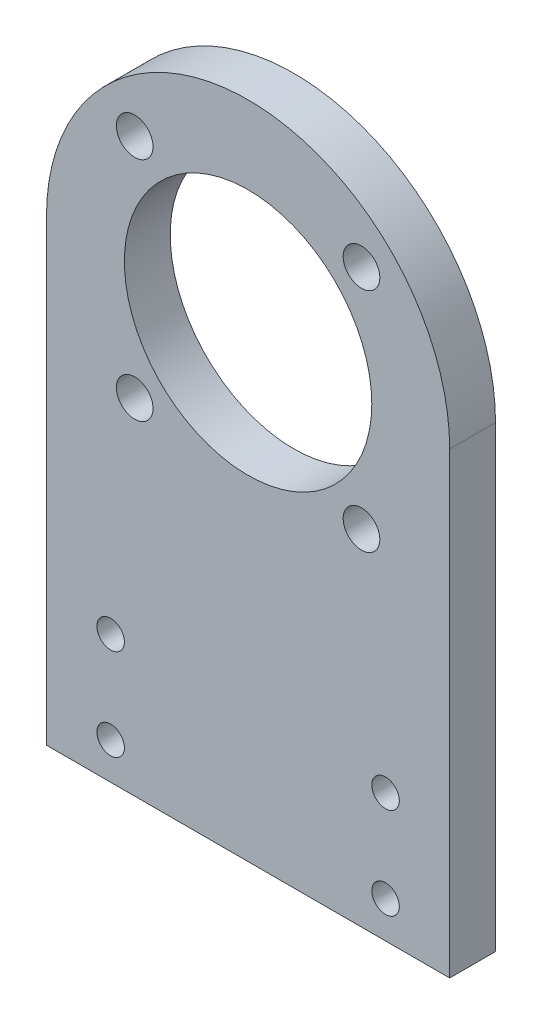
ISO-10303-21;
HEADER;
FILE_DESCRIPTION(('STEP AP214'),'2;1');
FILE_NAME('part.step','',(''),(''),'','','');
FILE_SCHEMA(('AUTOMOTIVE_DESIGN { 1 0 10303 214 1 1 1 1 }'));
ENDSEC;
DATA;
#1=APPLICATION_CONTEXT('core data for automotive mechanical design processes');
#2=APPLICATION_PROTOCOL_DEFINITION('international standard','automotive_design',2000,#1);
#3=PRODUCT_CONTEXT('',#1,'mechanical');
#4=PRODUCT('Part','Part','',(#3));
#5=PRODUCT_RELATED_PRODUCT_CATEGORY('part','',(#4));
#6=PRODUCT_DEFINITION_FORMATION('','',#4);
#7=PRODUCT_DEFINITION_CONTEXT('part definition',#1,'design');
#8=PRODUCT_DEFINITION('design','',#6,#7);
#9=PRODUCT_DEFINITION_SHAPE('','',#8);
#10=(LENGTH_UNIT() NAMED_UNIT(*) SI_UNIT(.MILLI.,.METRE.));
#11=(NAMED_UNIT(*) PLANE_ANGLE_UNIT() SI_UNIT($,.RADIAN.));
#12=(NAMED_UNIT(*) SI_UNIT($,.STERADIAN.) SOLID_ANGLE_UNIT());
#13=UNCERTAINTY_MEASURE_WITH_UNIT(LENGTH_MEASURE(1.E-05),#10,'distance_accuracy_value','');
#14=(GEOMETRIC_REPRESENTATION_CONTEXT(3) GLOBAL_UNCERTAINTY_ASSIGNED_CONTEXT((#13)) GLOBAL_UNIT_ASSIGNED_CONTEXT((#10,
#11,#12)) REPRESENTATION_CONTEXT('',''));
#15=CARTESIAN_POINT('',(0.,0.,0.));
#16=DIRECTION('',(0.,0.,1.));
#17=DIRECTION('',(1.,0.,0.));
#18=AXIS2_PLACEMENT_3D('',#15,#16,#17);
#19=CARTESIAN_POINT('',(1.17961196366423E-13,50.,5.));
#20=DIRECTION('',(0.,0.,1.));
#21=DIRECTION('',(1.,0.,0.));
#22=AXIS2_PLACEMENT_3D('',#19,#20,#21);
#23=PLANE('',#22);
#24=CARTESIAN_POINT('',(-12.3743686707645,37.6256313292355,5.));
#25=DIRECTION('',(0.,0.,-1.));
#26=DIRECTION('',(-1.,0.,0.));
#27=AXIS2_PLACEMENT_3D('',#24,#25,#26);
#28=CIRCLE('',#27,2.);
#29=CARTESIAN_POINT('',(-14.3743686707645,37.6256313292355,5.));
#30=VERTEX_POINT('',#29);
#31=EDGE_CURVE('E149',#30,#30,#28,.T.);
#32=ORIENTED_EDGE('',*,*,#31,.T.);
#33=EDGE_LOOP('',(#32));
#34=FACE_BOUND('',#33,.T.);
#35=CARTESIAN_POINT('',(12.3743686707647,37.6256313292354,5.));
#36=DIRECTION('',(0.,0.,-1.));
#37=DIRECTION('',(-1.,0.,0.));
#38=AXIS2_PLACEMENT_3D('',#35,#36,#37);
#39=CIRCLE('',#38,2.);
#40=CARTESIAN_POINT('',(10.3743686707647,37.6256313292354,5.));
#41=VERTEX_POINT('',#40);
#42=EDGE_CURVE('E161',#41,#41,#39,.T.);
#43=ORIENTED_EDGE('',*,*,#42,.T.);
#44=EDGE_LOOP('',(#43));
#45=FACE_BOUND('',#44,.T.);
#46=CARTESIAN_POINT('',(12.3743686707647,62.3743686707646,5.));
#47=DIRECTION('',(0.,0.,-1.));
#48=DIRECTION('',(-1.,0.,0.));
#49=AXIS2_PLACEMENT_3D('',#46,#47,#48);
#50=CIRCLE('',#49,2.);
#51=CARTESIAN_POINT('',(10.3743686707647,62.3743686707646,5.));
#52=VERTEX_POINT('',#51);
#53=EDGE_CURVE('E155',#52,#52,#50,.T.);
#54=ORIENTED_EDGE('',*,*,#53,.T.);
#55=EDGE_LOOP('',(#54));
#56=FACE_BOUND('',#55,.T.);
#57=CARTESIAN_POINT('',(-12.3743686707644,62.3743686707646,5.));
#58=DIRECTION('',(0.,0.,-1.));
#59=DIRECTION('',(-1.,0.,0.));
#60=AXIS2_PLACEMENT_3D('',#57,#58,#59);
#61=CIRCLE('',#60,2.);
#62=CARTESIAN_POINT('',(-14.3743686707645,62.3743686707646,5.));
#63=VERTEX_POINT('',#62);
#64=EDGE_CURVE('E143',#63,#63,#61,.T.);
#65=ORIENTED_EDGE('',*,*,#64,.T.);
#66=EDGE_LOOP('',(#65));
#67=FACE_BOUND('',#66,.T.);
#68=CARTESIAN_POINT('',(15.,14.,5.));
#69=DIRECTION('',(0.,0.,1.));
#70=DIRECTION('',(-1.,0.,0.));
#71=AXIS2_PLACEMENT_3D('',#68,#69,#70);
#72=CIRCLE('',#71,1.5);
#73=CARTESIAN_POINT('',(13.5,14.,5.));
#74=VERTEX_POINT('',#73);
#75=EDGE_CURVE('E131',#74,#74,#72,.T.);
#76=ORIENTED_EDGE('',*,*,#75,.F.);
#77=EDGE_LOOP('',(#76));
#78=FACE_BOUND('',#77,.T.);
#79=CARTESIAN_POINT('',(-15.,4.,5.));
#80=DIRECTION('',(0.,0.,1.));
#81=DIRECTION('',(1.,0.,0.));
#82=AXIS2_PLACEMENT_3D('',#79,#80,#81);
#83=CIRCLE('',#82,1.5);
#84=CARTESIAN_POINT('',(-13.5,4.,5.));
#85=VERTEX_POINT('',#84);
#86=EDGE_CURVE('E119',#85,#85,#83,.T.);
#87=ORIENTED_EDGE('',*,*,#86,.F.);
#88=EDGE_LOOP('',(#87));
#89=FACE_BOUND('',#88,.T.);
#90=DIRECTION('',(0.,-1.,0.));
#91=VECTOR('',#90,1.);
#92=CARTESIAN_POINT('',(-22.,0.,5.));
#93=LINE('',#92,#91);
#94=CARTESIAN_POINT('',(-21.9999999999999,50.,5.));
#95=VERTEX_POINT('',#94);
#96=CARTESIAN_POINT('',(-22.,0.,5.));
#97=VERTEX_POINT('',#96);
#98=EDGE_CURVE('E89',#95,#97,#93,.T.);
#99=ORIENTED_EDGE('',*,*,#98,.T.);
#100=DIRECTION('',(1.,0.,0.));
#101=VECTOR('',#100,1.);
#102=CARTESIAN_POINT('',(-22.,0.,5.));
#103=LINE('',#102,#101);
#104=CARTESIAN_POINT('',(22.,0.,5.));
#105=VERTEX_POINT('',#104);
#106=EDGE_CURVE('E84',#97,#105,#103,.T.);
#107=ORIENTED_EDGE('',*,*,#106,.T.);
#108=DIRECTION('',(0.,1.,0.));
#109=VECTOR('',#108,1.);
#110=CARTESIAN_POINT('',(22.,0.,5.));
#111=LINE('',#110,#109);
#112=CARTESIAN_POINT('',(22.,50.,5.));
#113=VERTEX_POINT('',#112);
#114=EDGE_CURVE('E87',#105,#113,#111,.T.);
#115=ORIENTED_EDGE('',*,*,#114,.T.);
#116=CARTESIAN_POINT('',(1.17961196366423E-13,50.,5.));
#117=DIRECTION('',(0.,0.,1.));
#118=DIRECTION('',(1.,0.,0.));
#119=AXIS2_PLACEMENT_3D('',#116,#117,#118);
#120=CIRCLE('',#119,22.);
#121=EDGE_CURVE('E54',#113,#95,#120,.T.);
#122=ORIENTED_EDGE('',*,*,#121,.T.);
#123=EDGE_LOOP('',(#99,#107,#115,#122));
#124=FACE_BOUND('',#123,.T.);
#125=CARTESIAN_POINT('',(-15.,14.,5.));
#126=DIRECTION('',(0.,0.,1.));
#127=DIRECTION('',(1.,0.,0.));
#128=AXIS2_PLACEMENT_3D('',#125,#126,#127);
#129=CIRCLE('',#128,1.5);
#130=CARTESIAN_POINT('',(-13.5,14.,5.));
#131=VERTEX_POINT('',#130);
#132=EDGE_CURVE('E104',#131,#131,#129,.T.);
#133=ORIENTED_EDGE('',*,*,#132,.F.);
#134=EDGE_LOOP('',(#133));
#135=FACE_BOUND('',#134,.T.);
#136=CARTESIAN_POINT('',(15.,4.,5.));
#137=DIRECTION('',(0.,0.,1.));
#138=DIRECTION('',(-1.,0.,0.));
#139=AXIS2_PLACEMENT_3D('',#136,#137,#138);
#140=CIRCLE('',#139,1.5);
#141=CARTESIAN_POINT('',(13.5,4.,5.));
#142=VERTEX_POINT('',#141);
#143=EDGE_CURVE('E125',#142,#142,#140,.T.);
#144=ORIENTED_EDGE('',*,*,#143,.F.);
#145=EDGE_LOOP('',(#144));
#146=FACE_BOUND('',#145,.T.);
#147=CARTESIAN_POINT('',(1.17961196366423E-13,50.,5.));
#148=DIRECTION('',(0.,0.,1.));
#149=DIRECTION('',(1.,0.,0.));
#150=AXIS2_PLACEMENT_3D('',#147,#148,#149);
#151=CIRCLE('',#150,13.5);
#152=CARTESIAN_POINT('',(13.5000000000001,50.,5.));
#153=VERTEX_POINT('',#152);
#154=EDGE_CURVE('E137',#153,#153,#151,.T.);
#155=ORIENTED_EDGE('',*,*,#154,.F.);
#156=EDGE_LOOP('',(#155));
#157=FACE_BOUND('',#156,.T.);
#158=ADVANCED_FACE('F37',(#34,#45,#56,#67,#78,#89,#124,#135,#146,#157),#23,.T.);
#159=CARTESIAN_POINT('',(1.17961196366423E-13,50.,0.));
#160=DIRECTION('',(0.,0.,1.));
#161=DIRECTION('',(1.,0.,0.));
#162=AXIS2_PLACEMENT_3D('',#159,#160,#161);
#163=PLANE('',#162);
#164=CARTESIAN_POINT('',(-12.3743686707645,37.6256313292355,0.));
#165=DIRECTION('',(0.,0.,-1.));
#166=DIRECTION('',(-1.,0.,0.));
#167=AXIS2_PLACEMENT_3D('',#164,#165,#166);
#168=CIRCLE('',#167,2.);
#169=CARTESIAN_POINT('',(-14.3743686707645,37.6256313292355,0.));
#170=VERTEX_POINT('',#169);
#171=EDGE_CURVE('E164',#170,#170,#168,.T.);
#172=ORIENTED_EDGE('',*,*,#171,.F.);
#173=EDGE_LOOP('',(#172));
#174=FACE_BOUND('',#173,.T.);
#175=CARTESIAN_POINT('',(12.3743686707647,37.6256313292354,0.));
#176=DIRECTION('',(0.,0.,-1.));
#177=DIRECTION('',(-1.,0.,0.));
#178=AXIS2_PLACEMENT_3D('',#175,#176,#177);
#179=CIRCLE('',#178,2.);
#180=CARTESIAN_POINT('',(10.3743686707647,37.6256313292354,0.));
#181=VERTEX_POINT('',#180);
#182=EDGE_CURVE('E158',#181,#181,#179,.T.);
#183=ORIENTED_EDGE('',*,*,#182,.F.);
#184=EDGE_LOOP('',(#183));
#185=FACE_BOUND('',#184,.T.);
#186=CARTESIAN_POINT('',(12.3743686707647,62.3743686707646,0.));
#187=DIRECTION('',(0.,0.,-1.));
#188=DIRECTION('',(-1.,0.,0.));
#189=AXIS2_PLACEMENT_3D('',#186,#187,#188);
#190=CIRCLE('',#189,2.);
#191=CARTESIAN_POINT('',(10.3743686707647,62.3743686707646,0.));
#192=VERTEX_POINT('',#191);
#193=EDGE_CURVE('E152',#192,#192,#190,.T.);
#194=ORIENTED_EDGE('',*,*,#193,.F.);
#195=EDGE_LOOP('',(#194));
#196=FACE_BOUND('',#195,.T.);
#197=CARTESIAN_POINT('',(-12.3743686707644,62.3743686707646,0.));
#198=DIRECTION('',(0.,0.,-1.));
#199=DIRECTION('',(-1.,0.,0.));
#200=AXIS2_PLACEMENT_3D('',#197,#198,#199);
#201=CIRCLE('',#200,2.);
#202=CARTESIAN_POINT('',(-14.3743686707645,62.3743686707646,0.));
#203=VERTEX_POINT('',#202);
#204=EDGE_CURVE('E146',#203,#203,#201,.T.);
#205=ORIENTED_EDGE('',*,*,#204,.F.);
#206=EDGE_LOOP('',(#205));
#207=FACE_BOUND('',#206,.T.);
#208=DIRECTION('',(0.,-1.,0.));
#209=VECTOR('',#208,1.);
#210=CARTESIAN_POINT('',(-22.,0.,0.));
#211=LINE('',#210,#209);
#212=CARTESIAN_POINT('',(-21.9999999999999,50.,0.));
#213=VERTEX_POINT('',#212);
#214=CARTESIAN_POINT('',(-22.,0.,0.));
#215=VERTEX_POINT('',#214);
#216=EDGE_CURVE('E101',#213,#215,#211,.T.);
#217=ORIENTED_EDGE('',*,*,#216,.F.);
#218=CARTESIAN_POINT('',(1.17961196366423E-13,50.,0.));
#219=DIRECTION('',(0.,0.,1.));
#220=DIRECTION('',(1.,0.,0.));
#221=AXIS2_PLACEMENT_3D('',#218,#219,#220);
#222=CIRCLE('',#221,22.);
#223=CARTESIAN_POINT('',(22.,50.,0.));
#224=VERTEX_POINT('',#223);
#225=EDGE_CURVE('E77',#224,#213,#222,.T.);
#226=ORIENTED_EDGE('',*,*,#225,.F.);
#227=DIRECTION('',(0.,1.,0.));
#228=VECTOR('',#227,1.);
#229=CARTESIAN_POINT('',(22.,0.,0.));
#230=LINE('',#229,#228);
#231=CARTESIAN_POINT('',(22.,0.,0.));
#232=VERTEX_POINT('',#231);
#233=EDGE_CURVE('E71',#232,#224,#230,.T.);
#234=ORIENTED_EDGE('',*,*,#233,.F.);
#235=DIRECTION('',(1.,0.,0.));
#236=VECTOR('',#235,1.);
#237=CARTESIAN_POINT('',(-22.,0.,0.));
#238=LINE('',#237,#236);
#239=EDGE_CURVE('E93',#215,#232,#238,.T.);
#240=ORIENTED_EDGE('',*,*,#239,.F.);
#241=EDGE_LOOP('',(#217,#226,#234,#240));
#242=FACE_BOUND('',#241,.T.);
#243=CARTESIAN_POINT('',(-15.,14.,0.));
#244=DIRECTION('',(0.,0.,1.));
#245=DIRECTION('',(1.,0.,0.));
#246=AXIS2_PLACEMENT_3D('',#243,#244,#245);
#247=CIRCLE('',#246,1.5);
#248=CARTESIAN_POINT('',(-13.5,14.,0.));
#249=VERTEX_POINT('',#248);
#250=EDGE_CURVE('E116',#249,#249,#247,.T.);
#251=ORIENTED_EDGE('',*,*,#250,.T.);
#252=EDGE_LOOP('',(#251));
#253=FACE_BOUND('',#252,.T.);
#254=CARTESIAN_POINT('',(-15.,4.,0.));
#255=DIRECTION('',(0.,0.,1.));
#256=DIRECTION('',(1.,0.,0.));
#257=AXIS2_PLACEMENT_3D('',#254,#255,#256);
#258=CIRCLE('',#257,1.5);
#259=CARTESIAN_POINT('',(-13.5,4.,0.));
#260=VERTEX_POINT('',#259);
#261=EDGE_CURVE('E122',#260,#260,#258,.T.);
#262=ORIENTED_EDGE('',*,*,#261,.T.);
#263=EDGE_LOOP('',(#262));
#264=FACE_BOUND('',#263,.T.);
#265=CARTESIAN_POINT('',(15.,4.,0.));
#266=DIRECTION('',(0.,0.,1.));
#267=DIRECTION('',(-1.,0.,0.));
#268=AXIS2_PLACEMENT_3D('',#265,#266,#267);
#269=CIRCLE('',#268,1.5);
#270=CARTESIAN_POINT('',(13.5,4.,0.));
#271=VERTEX_POINT('',#270);
#272=EDGE_CURVE('E128',#271,#271,#269,.T.);
#273=ORIENTED_EDGE('',*,*,#272,.T.);
#274=EDGE_LOOP('',(#273));
#275=FACE_BOUND('',#274,.T.);
#276=CARTESIAN_POINT('',(15.,14.,0.));
#277=DIRECTION('',(0.,0.,1.));
#278=DIRECTION('',(-1.,0.,0.));
#279=AXIS2_PLACEMENT_3D('',#276,#277,#278);
#280=CIRCLE('',#279,1.5);
#281=CARTESIAN_POINT('',(13.5,14.,0.));
#282=VERTEX_POINT('',#281);
#283=EDGE_CURVE('E134',#282,#282,#280,.T.);
#284=ORIENTED_EDGE('',*,*,#283,.T.);
#285=EDGE_LOOP('',(#284));
#286=FACE_BOUND('',#285,.T.);
#287=CARTESIAN_POINT('',(1.17961196366423E-13,50.,0.));
#288=DIRECTION('',(0.,0.,1.));
#289=DIRECTION('',(1.,0.,0.));
#290=AXIS2_PLACEMENT_3D('',#287,#288,#289);
#291=CIRCLE('',#290,13.5);
#292=CARTESIAN_POINT('',(13.5000000000001,50.,0.));
#293=VERTEX_POINT('',#292);
#294=EDGE_CURVE('E140',#293,#293,#291,.T.);
#295=ORIENTED_EDGE('',*,*,#294,.T.);
#296=EDGE_LOOP('',(#295));
#297=FACE_BOUND('',#296,.T.);
#298=ADVANCED_FACE('F112',(#174,#185,#196,#207,#242,#253,#264,#275,#286,#297),#163,.F.);
#299=CARTESIAN_POINT('',(-22.,0.,5.));
#300=DIRECTION('',(1.,0.,0.));
#301=DIRECTION('',(0.,0.,-1.));
#302=AXIS2_PLACEMENT_3D('',#299,#300,#301);
#303=PLANE('',#302);
#304=ORIENTED_EDGE('',*,*,#216,.T.);
#305=DIRECTION('',(0.,0.,-1.));
#306=VECTOR('',#305,1.);
#307=CARTESIAN_POINT('',(-22.,0.,5.));
#308=LINE('',#307,#306);
#309=EDGE_CURVE('E11',#97,#215,#308,.T.);
#310=ORIENTED_EDGE('',*,*,#309,.F.);
#311=ORIENTED_EDGE('',*,*,#98,.F.);
#312=DIRECTION('',(0.,0.,-1.));
#313=VECTOR('',#312,1.);
#314=CARTESIAN_POINT('',(-21.9999999999999,50.,5.));
#315=LINE('',#314,#313);
#316=EDGE_CURVE('E97',#95,#213,#315,.T.);
#317=ORIENTED_EDGE('',*,*,#316,.T.);
#318=EDGE_LOOP('',(#304,#310,#311,#317));
#319=FACE_BOUND('',#318,.T.);
#320=ADVANCED_FACE('F39',(#319),#303,.F.);
#321=CARTESIAN_POINT('',(-22.,0.,5.));
#322=DIRECTION('',(0.,1.,0.));
#323=DIRECTION('',(-1.,0.,0.));
#324=AXIS2_PLACEMENT_3D('',#321,#322,#323);
#325=PLANE('',#324);
#326=ORIENTED_EDGE('',*,*,#239,.T.);
#327=DIRECTION('',(0.,0.,-1.));
#328=VECTOR('',#327,1.);
#329=CARTESIAN_POINT('',(22.,0.,5.));
#330=LINE('',#329,#328);
#331=EDGE_CURVE('E46',#105,#232,#330,.T.);
#332=ORIENTED_EDGE('',*,*,#331,.F.);
#333=ORIENTED_EDGE('',*,*,#106,.F.);
#334=ORIENTED_EDGE('',*,*,#309,.T.);
#335=EDGE_LOOP('',(#326,#332,#333,#334));
#336=FACE_BOUND('',#335,.T.);
#337=ADVANCED_FACE('F92',(#336),#325,.F.);
#338=CARTESIAN_POINT('',(22.,0.,5.));
#339=DIRECTION('',(-1.,0.,0.));
#340=DIRECTION('',(0.,-1.,0.));
#341=AXIS2_PLACEMENT_3D('',#338,#339,#340);
#342=PLANE('',#341);
#343=ORIENTED_EDGE('',*,*,#233,.T.);
#344=DIRECTION('',(0.,0.,-1.));
#345=VECTOR('',#344,1.);
#346=CARTESIAN_POINT('',(22.,50.,5.));
#347=LINE('',#346,#345);
#348=EDGE_CURVE('E94',#113,#224,#347,.T.);
#349=ORIENTED_EDGE('',*,*,#348,.F.);
#350=ORIENTED_EDGE('',*,*,#114,.F.);
#351=ORIENTED_EDGE('',*,*,#331,.T.);
#352=EDGE_LOOP('',(#343,#349,#350,#351));
#353=FACE_BOUND('',#352,.T.);
#354=ADVANCED_FACE('F95',(#353),#342,.F.);
#355=CARTESIAN_POINT('',(1.17961196366423E-13,50.,5.));
#356=DIRECTION('',(0.,0.,-1.));
#357=DIRECTION('',(-1.,0.,0.));
#358=AXIS2_PLACEMENT_3D('',#355,#356,#357);
#359=CYLINDRICAL_SURFACE('',#358,22.);
#360=ORIENTED_EDGE('',*,*,#225,.T.);
#361=ORIENTED_EDGE('',*,*,#316,.F.);
#362=ORIENTED_EDGE('',*,*,#121,.F.);
#363=ORIENTED_EDGE('',*,*,#348,.T.);
#364=EDGE_LOOP('',(#360,#361,#362,#363));
#365=FACE_BOUND('',#364,.T.);
#366=ADVANCED_FACE('F109',(#365),#359,.T.);
#367=CARTESIAN_POINT('',(-15.,14.,5.));
#368=DIRECTION('',(0.,0.,-1.));
#369=DIRECTION('',(-1.,0.,0.));
#370=AXIS2_PLACEMENT_3D('',#367,#368,#369);
#371=CYLINDRICAL_SURFACE('',#370,1.5);
#372=ORIENTED_EDGE('',*,*,#132,.T.);
#373=EDGE_LOOP('',(#372));
#374=FACE_BOUND('',#373,.T.);
#375=ORIENTED_EDGE('',*,*,#250,.F.);
#376=EDGE_LOOP('',(#375));
#377=FACE_BOUND('',#376,.T.);
#378=ADVANCED_FACE('F209',(#374,#377),#371,.F.);
#379=CARTESIAN_POINT('',(-15.,4.,5.));
#380=DIRECTION('',(0.,0.,-1.));
#381=DIRECTION('',(-1.,0.,0.));
#382=AXIS2_PLACEMENT_3D('',#379,#380,#381);
#383=CYLINDRICAL_SURFACE('',#382,1.5);
#384=ORIENTED_EDGE('',*,*,#86,.T.);
#385=EDGE_LOOP('',(#384));
#386=FACE_BOUND('',#385,.T.);
#387=ORIENTED_EDGE('',*,*,#261,.F.);
#388=EDGE_LOOP('',(#387));
#389=FACE_BOUND('',#388,.T.);
#390=ADVANCED_FACE('F268',(#386,#389),#383,.F.);
#391=CARTESIAN_POINT('',(15.,4.,5.));
#392=DIRECTION('',(0.,0.,-1.));
#393=DIRECTION('',(-1.,0.,0.));
#394=AXIS2_PLACEMENT_3D('',#391,#392,#393);
#395=CYLINDRICAL_SURFACE('',#394,1.5);
#396=ORIENTED_EDGE('',*,*,#143,.T.);
#397=EDGE_LOOP('',(#396));
#398=FACE_BOUND('',#397,.T.);
#399=ORIENTED_EDGE('',*,*,#272,.F.);
#400=EDGE_LOOP('',(#399));
#401=FACE_BOUND('',#400,.T.);
#402=ADVANCED_FACE('F271',(#398,#401),#395,.F.);
#403=CARTESIAN_POINT('',(15.,14.,5.));
#404=DIRECTION('',(0.,0.,-1.));
#405=DIRECTION('',(-1.,0.,0.));
#406=AXIS2_PLACEMENT_3D('',#403,#404,#405);
#407=CYLINDRICAL_SURFACE('',#406,1.5);
#408=ORIENTED_EDGE('',*,*,#75,.T.);
#409=EDGE_LOOP('',(#408));
#410=FACE_BOUND('',#409,.T.);
#411=ORIENTED_EDGE('',*,*,#283,.F.);
#412=EDGE_LOOP('',(#411));
#413=FACE_BOUND('',#412,.T.);
#414=ADVANCED_FACE('F200',(#410,#413),#407,.F.);
#415=CARTESIAN_POINT('',(1.17961196366423E-13,50.,5.));
#416=DIRECTION('',(0.,0.,-1.));
#417=DIRECTION('',(-1.,0.,0.));
#418=AXIS2_PLACEMENT_3D('',#415,#416,#417);
#419=CYLINDRICAL_SURFACE('',#418,13.5);
#420=ORIENTED_EDGE('',*,*,#154,.T.);
#421=EDGE_LOOP('',(#420));
#422=FACE_BOUND('',#421,.T.);
#423=ORIENTED_EDGE('',*,*,#294,.F.);
#424=EDGE_LOOP('',(#423));
#425=FACE_BOUND('',#424,.T.);
#426=ADVANCED_FACE('F191',(#422,#425),#419,.F.);
#427=CARTESIAN_POINT('',(-12.3743686707644,62.3743686707646,5.));
#428=DIRECTION('',(0.,0.,-1.));
#429=DIRECTION('',(-1.,0.,0.));
#430=AXIS2_PLACEMENT_3D('',#427,#428,#429);
#431=CYLINDRICAL_SURFACE('',#430,2.);
#432=ORIENTED_EDGE('',*,*,#64,.F.);
#433=EDGE_LOOP('',(#432));
#434=FACE_BOUND('',#433,.T.);
#435=ORIENTED_EDGE('',*,*,#204,.T.);
#436=EDGE_LOOP('',(#435));
#437=FACE_BOUND('',#436,.T.);
#438=ADVANCED_FACE('F188',(#434,#437),#431,.F.);
#439=CARTESIAN_POINT('',(12.3743686707647,62.3743686707646,5.));
#440=DIRECTION('',(0.,0.,-1.));
#441=DIRECTION('',(-1.,0.,0.));
#442=AXIS2_PLACEMENT_3D('',#439,#440,#441);
#443=CYLINDRICAL_SURFACE('',#442,2.);
#444=ORIENTED_EDGE('',*,*,#53,.F.);
#445=EDGE_LOOP('',(#444));
#446=FACE_BOUND('',#445,.T.);
#447=ORIENTED_EDGE('',*,*,#193,.T.);
#448=EDGE_LOOP('',(#447));
#449=FACE_BOUND('',#448,.T.);
#450=ADVANCED_FACE('F190',(#446,#449),#443,.F.);
#451=CARTESIAN_POINT('',(12.3743686707647,37.6256313292354,5.));
#452=DIRECTION('',(0.,0.,-1.));
#453=DIRECTION('',(-1.,0.,0.));
#454=AXIS2_PLACEMENT_3D('',#451,#452,#453);
#455=CYLINDRICAL_SURFACE('',#454,2.);
#456=ORIENTED_EDGE('',*,*,#42,.F.);
#457=EDGE_LOOP('',(#456));
#458=FACE_BOUND('',#457,.T.);
#459=ORIENTED_EDGE('',*,*,#182,.T.);
#460=EDGE_LOOP('',(#459));
#461=FACE_BOUND('',#460,.T.);
#462=ADVANCED_FACE('F175',(#458,#461),#455,.F.);
#463=CARTESIAN_POINT('',(-12.3743686707645,37.6256313292355,5.));
#464=DIRECTION('',(0.,0.,-1.));
#465=DIRECTION('',(-1.,0.,0.));
#466=AXIS2_PLACEMENT_3D('',#463,#464,#465);
#467=CYLINDRICAL_SURFACE('',#466,2.);
#468=ORIENTED_EDGE('',*,*,#31,.F.);
#469=EDGE_LOOP('',(#468));
#470=FACE_BOUND('',#469,.T.);
#471=ORIENTED_EDGE('',*,*,#171,.T.);
#472=EDGE_LOOP('',(#471));
#473=FACE_BOUND('',#472,.T.);
#474=ADVANCED_FACE('F172',(#470,#473),#467,.F.);
#475=CLOSED_SHELL('',(#158,#298,#320,#337,#354,#366,#378,#390,#402,#414,#426,#438,#450,#462,#474));
#476=MANIFOLD_SOLID_BREP('B2',#475);
#477=ADVANCED_BREP_SHAPE_REPRESENTATION('',(#18,#476),#14);
#478=SHAPE_DEFINITION_REPRESENTATION(#9,#477);
ENDSEC;
END-ISO-10303-21;
